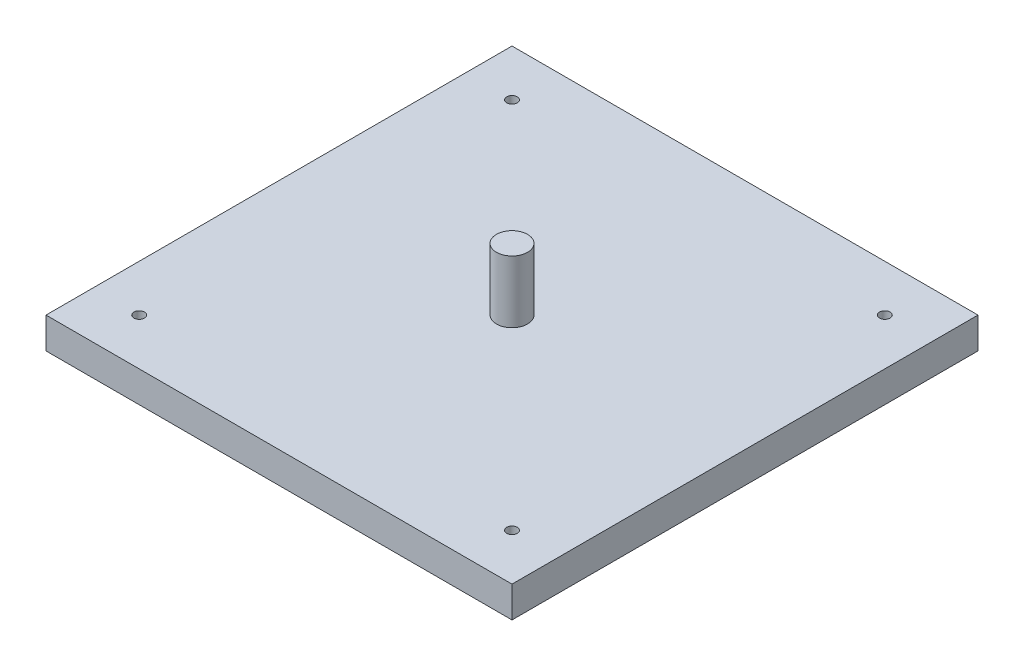
ISO-10303-21;
HEADER;
FILE_DESCRIPTION(('STEP AP214'),'2;1');
FILE_NAME('part.step','',(''),(''),'','','');
FILE_SCHEMA(('AUTOMOTIVE_DESIGN { 1 0 10303 214 1 1 1 1 }'));
ENDSEC;
DATA;
#1=APPLICATION_CONTEXT('core data for automotive mechanical design processes');
#2=APPLICATION_PROTOCOL_DEFINITION('international standard','automotive_design',2000,#1);
#3=PRODUCT_CONTEXT('',#1,'mechanical');
#4=PRODUCT('Part','Part','',(#3));
#5=PRODUCT_RELATED_PRODUCT_CATEGORY('part','',(#4));
#6=PRODUCT_DEFINITION_FORMATION('','',#4);
#7=PRODUCT_DEFINITION_CONTEXT('part definition',#1,'design');
#8=PRODUCT_DEFINITION('design','',#6,#7);
#9=PRODUCT_DEFINITION_SHAPE('','',#8);
#10=(LENGTH_UNIT() NAMED_UNIT(*) SI_UNIT(.MILLI.,.METRE.));
#11=(NAMED_UNIT(*) PLANE_ANGLE_UNIT() SI_UNIT($,.RADIAN.));
#12=(NAMED_UNIT(*) SI_UNIT($,.STERADIAN.) SOLID_ANGLE_UNIT());
#13=UNCERTAINTY_MEASURE_WITH_UNIT(LENGTH_MEASURE(1.E-05),#10,'distance_accuracy_value','');
#14=(GEOMETRIC_REPRESENTATION_CONTEXT(3) GLOBAL_UNCERTAINTY_ASSIGNED_CONTEXT((#13)) GLOBAL_UNIT_ASSIGNED_CONTEXT((#10,
#11,#12)) REPRESENTATION_CONTEXT('',''));
#15=CARTESIAN_POINT('',(0.,0.,0.));
#16=DIRECTION('',(0.,0.,1.));
#17=DIRECTION('',(1.,0.,0.));
#18=AXIS2_PLACEMENT_3D('',#15,#16,#17);
#19=CARTESIAN_POINT('',(0.,10.,75.));
#20=DIRECTION('',(0.,0.,-1.));
#21=DIRECTION('',(-1.,0.,0.));
#22=AXIS2_PLACEMENT_3D('',#19,#20,#21);
#23=PLANE('',#22);
#24=DIRECTION('',(1.,0.,0.));
#25=VECTOR('',#24,1.);
#26=CARTESIAN_POINT('',(0.,0.,75.));
#27=LINE('',#26,#25);
#28=CARTESIAN_POINT('',(-75.,0.,75.));
#29=VERTEX_POINT('',#28);
#30=CARTESIAN_POINT('',(75.,0.,75.));
#31=VERTEX_POINT('',#30);
#32=EDGE_CURVE('E129',#29,#31,#27,.T.);
#33=ORIENTED_EDGE('',*,*,#32,.T.);
#34=DIRECTION('',(0.,-1.,0.));
#35=VECTOR('',#34,1.);
#36=CARTESIAN_POINT('',(75.,10.,75.));
#37=LINE('',#36,#35);
#38=CARTESIAN_POINT('',(75.,10.,75.));
#39=VERTEX_POINT('',#38);
#40=EDGE_CURVE('E11',#39,#31,#37,.T.);
#41=ORIENTED_EDGE('',*,*,#40,.F.);
#42=DIRECTION('',(1.,0.,0.));
#43=VECTOR('',#42,1.);
#44=CARTESIAN_POINT('',(0.,10.,75.));
#45=LINE('',#44,#43);
#46=CARTESIAN_POINT('',(-75.,10.,75.));
#47=VERTEX_POINT('',#46);
#48=EDGE_CURVE('E105',#47,#39,#45,.T.);
#49=ORIENTED_EDGE('',*,*,#48,.F.);
#50=DIRECTION('',(0.,-1.,0.));
#51=VECTOR('',#50,1.);
#52=CARTESIAN_POINT('',(-75.,10.,75.));
#53=LINE('',#52,#51);
#54=EDGE_CURVE('E66',#47,#29,#53,.T.);
#55=ORIENTED_EDGE('',*,*,#54,.T.);
#56=EDGE_LOOP('',(#33,#41,#49,#55));
#57=FACE_BOUND('',#56,.T.);
#58=ADVANCED_FACE('F51',(#57),#23,.F.);
#59=CARTESIAN_POINT('',(75.,10.,0.));
#60=DIRECTION('',(-1.,0.,0.));
#61=DIRECTION('',(0.,0.,1.));
#62=AXIS2_PLACEMENT_3D('',#59,#60,#61);
#63=PLANE('',#62);
#64=DIRECTION('',(0.,0.,-1.));
#65=VECTOR('',#64,1.);
#66=CARTESIAN_POINT('',(75.,0.,0.));
#67=LINE('',#66,#65);
#68=CARTESIAN_POINT('',(75.,0.,-75.));
#69=VERTEX_POINT('',#68);
#70=EDGE_CURVE('E110',#31,#69,#67,.T.);
#71=ORIENTED_EDGE('',*,*,#70,.T.);
#72=DIRECTION('',(0.,-1.,0.));
#73=VECTOR('',#72,1.);
#74=CARTESIAN_POINT('',(75.,10.,-75.));
#75=LINE('',#74,#73);
#76=CARTESIAN_POINT('',(75.,10.,-75.));
#77=VERTEX_POINT('',#76);
#78=EDGE_CURVE('E58',#77,#69,#75,.T.);
#79=ORIENTED_EDGE('',*,*,#78,.F.);
#80=DIRECTION('',(0.,0.,-1.));
#81=VECTOR('',#80,1.);
#82=CARTESIAN_POINT('',(75.,10.,0.));
#83=LINE('',#82,#81);
#84=EDGE_CURVE('E93',#39,#77,#83,.T.);
#85=ORIENTED_EDGE('',*,*,#84,.F.);
#86=ORIENTED_EDGE('',*,*,#40,.T.);
#87=EDGE_LOOP('',(#71,#79,#85,#86));
#88=FACE_BOUND('',#87,.T.);
#89=ADVANCED_FACE('F107',(#88),#63,.F.);
#90=CARTESIAN_POINT('',(0.,10.,-75.));
#91=DIRECTION('',(0.,0.,-1.));
#92=DIRECTION('',(-1.,0.,0.));
#93=AXIS2_PLACEMENT_3D('',#90,#91,#92);
#94=PLANE('',#93);
#95=DIRECTION('',(1.,0.,0.));
#96=VECTOR('',#95,1.);
#97=CARTESIAN_POINT('',(0.,0.,-75.));
#98=LINE('',#97,#96);
#99=CARTESIAN_POINT('',(-75.,0.,-75.));
#100=VERTEX_POINT('',#99);
#101=EDGE_CURVE('E135',#100,#69,#98,.T.);
#102=ORIENTED_EDGE('',*,*,#101,.F.);
#103=DIRECTION('',(0.,-1.,0.));
#104=VECTOR('',#103,1.);
#105=CARTESIAN_POINT('',(-75.,10.,-75.));
#106=LINE('',#105,#104);
#107=CARTESIAN_POINT('',(-75.,10.,-75.));
#108=VERTEX_POINT('',#107);
#109=EDGE_CURVE('E85',#108,#100,#106,.T.);
#110=ORIENTED_EDGE('',*,*,#109,.F.);
#111=DIRECTION('',(1.,0.,0.));
#112=VECTOR('',#111,1.);
#113=CARTESIAN_POINT('',(0.,10.,-75.));
#114=LINE('',#113,#112);
#115=EDGE_CURVE('E102',#108,#77,#114,.T.);
#116=ORIENTED_EDGE('',*,*,#115,.T.);
#117=ORIENTED_EDGE('',*,*,#78,.T.);
#118=EDGE_LOOP('',(#102,#110,#116,#117));
#119=FACE_BOUND('',#118,.T.);
#120=ADVANCED_FACE('F106',(#119),#94,.T.);
#121=CARTESIAN_POINT('',(60.,10.,60.));
#122=DIRECTION('',(0.,-1.,0.));
#123=DIRECTION('',(0.,0.,-1.));
#124=AXIS2_PLACEMENT_3D('',#121,#122,#123);
#125=CYLINDRICAL_SURFACE('',#124,1.7);
#126=CARTESIAN_POINT('',(60.,10.,60.));
#127=DIRECTION('',(0.,1.,0.));
#128=DIRECTION('',(0.,0.,1.));
#129=AXIS2_PLACEMENT_3D('',#126,#127,#128);
#130=CIRCLE('',#129,1.7);
#131=CARTESIAN_POINT('',(60.,10.,61.7));
#132=VERTEX_POINT('',#131);
#133=EDGE_CURVE('E111',#132,#132,#130,.T.);
#134=ORIENTED_EDGE('',*,*,#133,.T.);
#135=EDGE_LOOP('',(#134));
#136=FACE_BOUND('',#135,.T.);
#137=CARTESIAN_POINT('',(60.,0.,60.));
#138=DIRECTION('',(0.,1.,0.));
#139=DIRECTION('',(0.,0.,1.));
#140=AXIS2_PLACEMENT_3D('',#137,#138,#139);
#141=CIRCLE('',#140,1.7);
#142=CARTESIAN_POINT('',(60.,0.,61.7));
#143=VERTEX_POINT('',#142);
#144=EDGE_CURVE('E140',#143,#143,#141,.T.);
#145=ORIENTED_EDGE('',*,*,#144,.F.);
#146=EDGE_LOOP('',(#145));
#147=FACE_BOUND('',#146,.T.);
#148=ADVANCED_FACE('F194',(#136,#147),#125,.F.);
#149=CARTESIAN_POINT('',(-75.,10.,0.));
#150=DIRECTION('',(-1.,0.,0.));
#151=DIRECTION('',(0.,0.,1.));
#152=AXIS2_PLACEMENT_3D('',#149,#150,#151);
#153=PLANE('',#152);
#154=DIRECTION('',(0.,0.,-1.));
#155=VECTOR('',#154,1.);
#156=CARTESIAN_POINT('',(-75.,0.,0.));
#157=LINE('',#156,#155);
#158=EDGE_CURVE('E132',#29,#100,#157,.T.);
#159=ORIENTED_EDGE('',*,*,#158,.F.);
#160=ORIENTED_EDGE('',*,*,#54,.F.);
#161=DIRECTION('',(0.,0.,-1.));
#162=VECTOR('',#161,1.);
#163=CARTESIAN_POINT('',(-75.,10.,0.));
#164=LINE('',#163,#162);
#165=EDGE_CURVE('E112',#47,#108,#164,.T.);
#166=ORIENTED_EDGE('',*,*,#165,.T.);
#167=ORIENTED_EDGE('',*,*,#109,.T.);
#168=EDGE_LOOP('',(#159,#160,#166,#167));
#169=FACE_BOUND('',#168,.T.);
#170=ADVANCED_FACE('F190',(#169),#153,.T.);
#171=CARTESIAN_POINT('',(-60.,10.,-60.));
#172=DIRECTION('',(0.,-1.,0.));
#173=DIRECTION('',(0.,0.,-1.));
#174=AXIS2_PLACEMENT_3D('',#171,#172,#173);
#175=CYLINDRICAL_SURFACE('',#174,1.7);
#176=CARTESIAN_POINT('',(-60.,10.,-60.));
#177=DIRECTION('',(0.,1.,0.));
#178=DIRECTION('',(0.,0.,1.));
#179=AXIS2_PLACEMENT_3D('',#176,#177,#178);
#180=CIRCLE('',#179,1.7);
#181=CARTESIAN_POINT('',(-60.,10.,-58.3));
#182=VERTEX_POINT('',#181);
#183=EDGE_CURVE('E153',#182,#182,#180,.T.);
#184=ORIENTED_EDGE('',*,*,#183,.T.);
#185=EDGE_LOOP('',(#184));
#186=FACE_BOUND('',#185,.T.);
#187=CARTESIAN_POINT('',(-60.,0.,-60.));
#188=DIRECTION('',(0.,1.,0.));
#189=DIRECTION('',(0.,0.,1.));
#190=AXIS2_PLACEMENT_3D('',#187,#188,#189);
#191=CIRCLE('',#190,1.7);
#192=CARTESIAN_POINT('',(-60.,0.,-58.3));
#193=VERTEX_POINT('',#192);
#194=EDGE_CURVE('E124',#193,#193,#191,.T.);
#195=ORIENTED_EDGE('',*,*,#194,.F.);
#196=EDGE_LOOP('',(#195));
#197=FACE_BOUND('',#196,.T.);
#198=ADVANCED_FACE('F158',(#186,#197),#175,.F.);
#199=CARTESIAN_POINT('',(60.,10.,-60.));
#200=DIRECTION('',(0.,-1.,0.));
#201=DIRECTION('',(0.,0.,-1.));
#202=AXIS2_PLACEMENT_3D('',#199,#200,#201);
#203=CYLINDRICAL_SURFACE('',#202,1.7);
#204=CARTESIAN_POINT('',(60.,10.,-60.));
#205=DIRECTION('',(0.,1.,0.));
#206=DIRECTION('',(0.,0.,1.));
#207=AXIS2_PLACEMENT_3D('',#204,#205,#206);
#208=CIRCLE('',#207,1.7);
#209=CARTESIAN_POINT('',(60.,10.,-58.3));
#210=VERTEX_POINT('',#209);
#211=EDGE_CURVE('E149',#210,#210,#208,.F.);
#212=ORIENTED_EDGE('',*,*,#211,.F.);
#213=EDGE_LOOP('',(#212));
#214=FACE_BOUND('',#213,.T.);
#215=CARTESIAN_POINT('',(60.,0.,-60.));
#216=DIRECTION('',(0.,1.,0.));
#217=DIRECTION('',(0.,0.,1.));
#218=AXIS2_PLACEMENT_3D('',#215,#216,#217);
#219=CIRCLE('',#218,1.7);
#220=CARTESIAN_POINT('',(60.,0.,-58.3));
#221=VERTEX_POINT('',#220);
#222=EDGE_CURVE('E122',#221,#221,#219,.F.);
#223=ORIENTED_EDGE('',*,*,#222,.T.);
#224=EDGE_LOOP('',(#223));
#225=FACE_BOUND('',#224,.T.);
#226=ADVANCED_FACE('F52',(#214,#225),#203,.F.);
#227=CARTESIAN_POINT('',(-60.,10.,60.));
#228=DIRECTION('',(0.,-1.,0.));
#229=DIRECTION('',(0.,0.,-1.));
#230=AXIS2_PLACEMENT_3D('',#227,#228,#229);
#231=CYLINDRICAL_SURFACE('',#230,1.7);
#232=CARTESIAN_POINT('',(-60.,10.,60.));
#233=DIRECTION('',(0.,1.,0.));
#234=DIRECTION('',(0.,0.,1.));
#235=AXIS2_PLACEMENT_3D('',#232,#233,#234);
#236=CIRCLE('',#235,1.7);
#237=CARTESIAN_POINT('',(-60.,10.,61.7));
#238=VERTEX_POINT('',#237);
#239=EDGE_CURVE('E119',#238,#238,#236,.F.);
#240=ORIENTED_EDGE('',*,*,#239,.F.);
#241=EDGE_LOOP('',(#240));
#242=FACE_BOUND('',#241,.T.);
#243=CARTESIAN_POINT('',(-60.,0.,60.));
#244=DIRECTION('',(0.,1.,0.));
#245=DIRECTION('',(0.,0.,1.));
#246=AXIS2_PLACEMENT_3D('',#243,#244,#245);
#247=CIRCLE('',#246,1.7);
#248=CARTESIAN_POINT('',(-60.,0.,61.7));
#249=VERTEX_POINT('',#248);
#250=EDGE_CURVE('E139',#249,#249,#247,.F.);
#251=ORIENTED_EDGE('',*,*,#250,.T.);
#252=EDGE_LOOP('',(#251));
#253=FACE_BOUND('',#252,.T.);
#254=ADVANCED_FACE('F161',(#242,#253),#231,.F.);
#255=CARTESIAN_POINT('',(0.,10.,0.));
#256=DIRECTION('',(0.,1.,0.));
#257=DIRECTION('',(0.,0.,1.));
#258=AXIS2_PLACEMENT_3D('',#255,#256,#257);
#259=PLANE('',#258);
#260=CARTESIAN_POINT('',(0.,10.,0.));
#261=DIRECTION('',(0.,1.,0.));
#262=DIRECTION('',(0.,0.,1.));
#263=AXIS2_PLACEMENT_3D('',#260,#261,#262);
#264=CIRCLE('',#263,5.);
#265=CARTESIAN_POINT('',(0.,10.,5.00000000000002));
#266=VERTEX_POINT('',#265);
#267=EDGE_CURVE('E142',#266,#266,#264,.T.);
#268=ORIENTED_EDGE('',*,*,#267,.F.);
#269=EDGE_LOOP('',(#268));
#270=FACE_BOUND('',#269,.T.);
#271=ORIENTED_EDGE('',*,*,#211,.T.);
#272=EDGE_LOOP('',(#271));
#273=FACE_BOUND('',#272,.T.);
#274=ORIENTED_EDGE('',*,*,#183,.F.);
#275=EDGE_LOOP('',(#274));
#276=FACE_BOUND('',#275,.T.);
#277=ORIENTED_EDGE('',*,*,#48,.T.);
#278=ORIENTED_EDGE('',*,*,#84,.T.);
#279=ORIENTED_EDGE('',*,*,#115,.F.);
#280=ORIENTED_EDGE('',*,*,#165,.F.);
#281=EDGE_LOOP('',(#277,#278,#279,#280));
#282=FACE_BOUND('',#281,.T.);
#283=ORIENTED_EDGE('',*,*,#133,.F.);
#284=EDGE_LOOP('',(#283));
#285=FACE_BOUND('',#284,.T.);
#286=ORIENTED_EDGE('',*,*,#239,.T.);
#287=EDGE_LOOP('',(#286));
#288=FACE_BOUND('',#287,.T.);
#289=ADVANCED_FACE('F100',(#270,#273,#276,#282,#285,#288),#259,.T.);
#290=CARTESIAN_POINT('',(0.,0.,0.));
#291=DIRECTION('',(0.,1.,0.));
#292=DIRECTION('',(0.,0.,1.));
#293=AXIS2_PLACEMENT_3D('',#290,#291,#292);
#294=PLANE('',#293);
#295=ORIENTED_EDGE('',*,*,#222,.F.);
#296=EDGE_LOOP('',(#295));
#297=FACE_BOUND('',#296,.T.);
#298=ORIENTED_EDGE('',*,*,#194,.T.);
#299=EDGE_LOOP('',(#298));
#300=FACE_BOUND('',#299,.T.);
#301=ORIENTED_EDGE('',*,*,#32,.F.);
#302=ORIENTED_EDGE('',*,*,#158,.T.);
#303=ORIENTED_EDGE('',*,*,#101,.T.);
#304=ORIENTED_EDGE('',*,*,#70,.F.);
#305=EDGE_LOOP('',(#301,#302,#303,#304));
#306=FACE_BOUND('',#305,.T.);
#307=ORIENTED_EDGE('',*,*,#144,.T.);
#308=EDGE_LOOP('',(#307));
#309=FACE_BOUND('',#308,.T.);
#310=ORIENTED_EDGE('',*,*,#250,.F.);
#311=EDGE_LOOP('',(#310));
#312=FACE_BOUND('',#311,.T.);
#313=ADVANCED_FACE('F164',(#297,#300,#306,#309,#312),#294,.F.);
#314=CARTESIAN_POINT('',(0.,30.,0.));
#315=DIRECTION('',(0.,-1.,0.));
#316=DIRECTION('',(0.,0.,-1.));
#317=AXIS2_PLACEMENT_3D('',#314,#315,#316);
#318=CYLINDRICAL_SURFACE('',#317,5.);
#319=ORIENTED_EDGE('',*,*,#267,.T.);
#320=EDGE_LOOP('',(#319));
#321=FACE_BOUND('',#320,.T.);
#322=CARTESIAN_POINT('',(0.,30.,0.));
#323=DIRECTION('',(0.,1.,0.));
#324=DIRECTION('',(0.,0.,1.));
#325=AXIS2_PLACEMENT_3D('',#322,#323,#324);
#326=CIRCLE('',#325,5.);
#327=CARTESIAN_POINT('',(0.,30.,5.00000000000002));
#328=VERTEX_POINT('',#327);
#329=EDGE_CURVE('E128',#328,#328,#326,.T.);
#330=ORIENTED_EDGE('',*,*,#329,.F.);
#331=EDGE_LOOP('',(#330));
#332=FACE_BOUND('',#331,.T.);
#333=ADVANCED_FACE('F175',(#321,#332),#318,.T.);
#334=CARTESIAN_POINT('',(0.,30.,0.));
#335=DIRECTION('',(0.,1.,0.));
#336=DIRECTION('',(0.,0.,1.));
#337=AXIS2_PLACEMENT_3D('',#334,#335,#336);
#338=PLANE('',#337);
#339=ORIENTED_EDGE('',*,*,#329,.T.);
#340=EDGE_LOOP('',(#339));
#341=FACE_BOUND('',#340,.T.);
#342=ADVANCED_FACE('F254',(#341),#338,.T.);
#343=CLOSED_SHELL('',(#58,#89,#120,#148,#170,#198,#226,#254,#289,#313,#333,#342));
#344=MANIFOLD_SOLID_BREP('B2',#343);
#345=ADVANCED_BREP_SHAPE_REPRESENTATION('',(#18,#344),#14);
#346=SHAPE_DEFINITION_REPRESENTATION(#9,#345);
ENDSEC;
END-ISO-10303-21;
